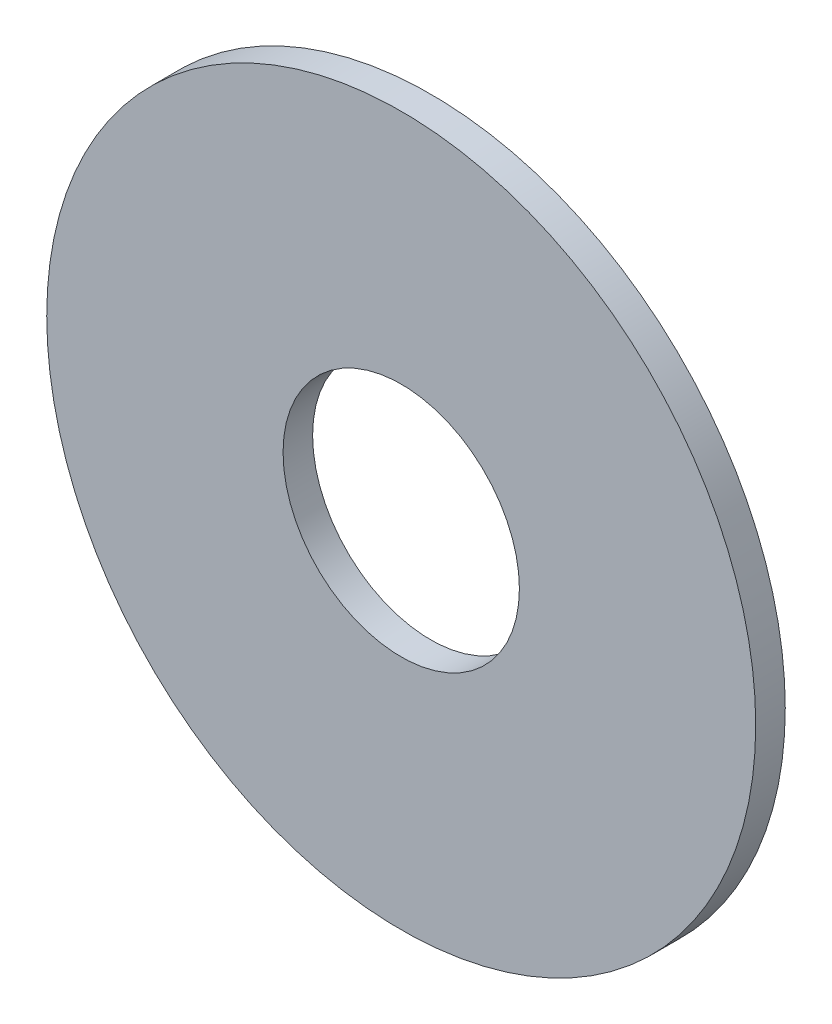
ISO-10303-21;
HEADER;
FILE_DESCRIPTION(('STEP AP214'),'2;1');
FILE_NAME('part.step','',(''),(''),'','','');
FILE_SCHEMA(('AUTOMOTIVE_DESIGN { 1 0 10303 214 1 1 1 1 }'));
ENDSEC;
DATA;
#1=APPLICATION_CONTEXT('core data for automotive mechanical design processes');
#2=APPLICATION_PROTOCOL_DEFINITION('international standard','automotive_design',2000,#1);
#3=PRODUCT_CONTEXT('',#1,'mechanical');
#4=PRODUCT('Part','Part','',(#3));
#5=PRODUCT_RELATED_PRODUCT_CATEGORY('part','',(#4));
#6=PRODUCT_DEFINITION_FORMATION('','',#4);
#7=PRODUCT_DEFINITION_CONTEXT('part definition',#1,'design');
#8=PRODUCT_DEFINITION('design','',#6,#7);
#9=PRODUCT_DEFINITION_SHAPE('','',#8);
#10=(LENGTH_UNIT() NAMED_UNIT(*) SI_UNIT(.MILLI.,.METRE.));
#11=(NAMED_UNIT(*) PLANE_ANGLE_UNIT() SI_UNIT($,.RADIAN.));
#12=(NAMED_UNIT(*) SI_UNIT($,.STERADIAN.) SOLID_ANGLE_UNIT());
#13=UNCERTAINTY_MEASURE_WITH_UNIT(LENGTH_MEASURE(1.E-05),#10,'distance_accuracy_value','');
#14=(GEOMETRIC_REPRESENTATION_CONTEXT(3) GLOBAL_UNCERTAINTY_ASSIGNED_CONTEXT((#13)) GLOBAL_UNIT_ASSIGNED_CONTEXT((#10,
#11,#12)) REPRESENTATION_CONTEXT('',''));
#15=CARTESIAN_POINT('',(0.,0.,0.));
#16=DIRECTION('',(0.,0.,1.));
#17=DIRECTION('',(1.,0.,0.));
#18=AXIS2_PLACEMENT_3D('',#15,#16,#17);
#19=CARTESIAN_POINT('',(0.,0.,0.5));
#20=DIRECTION('',(0.,0.,1.));
#21=DIRECTION('',(1.,0.,0.));
#22=AXIS2_PLACEMENT_3D('',#19,#20,#21);
#23=PLANE('',#22);
#24=CARTESIAN_POINT('',(0.,0.,0.5));
#25=DIRECTION('',(0.,0.,1.));
#26=DIRECTION('',(1.,0.,0.));
#27=AXIS2_PLACEMENT_3D('',#24,#25,#26);
#28=CIRCLE('',#27,6.);
#29=CARTESIAN_POINT('',(6.,0.,0.5));
#30=VERTEX_POINT('',#29);
#31=EDGE_CURVE('E10',#30,#30,#28,.T.);
#32=ORIENTED_EDGE('',*,*,#31,.T.);
#33=EDGE_LOOP('',(#32));
#34=FACE_BOUND('',#33,.T.);
#35=CARTESIAN_POINT('',(0.,0.,0.5));
#36=DIRECTION('',(0.,0.,1.));
#37=DIRECTION('',(1.,0.,0.));
#38=AXIS2_PLACEMENT_3D('',#35,#36,#37);
#39=CIRCLE('',#38,2.);
#40=CARTESIAN_POINT('',(2.,0.,0.5));
#41=VERTEX_POINT('',#40);
#42=EDGE_CURVE('E51',#41,#41,#39,.T.);
#43=ORIENTED_EDGE('',*,*,#42,.F.);
#44=EDGE_LOOP('',(#43));
#45=FACE_BOUND('',#44,.T.);
#46=ADVANCED_FACE('F40',(#34,#45),#23,.T.);
#47=CARTESIAN_POINT('',(0.,0.,0.));
#48=DIRECTION('',(0.,0.,1.));
#49=DIRECTION('',(1.,0.,0.));
#50=AXIS2_PLACEMENT_3D('',#47,#48,#49);
#51=PLANE('',#50);
#52=CARTESIAN_POINT('',(0.,0.,0.));
#53=DIRECTION('',(0.,0.,1.));
#54=DIRECTION('',(1.,0.,0.));
#55=AXIS2_PLACEMENT_3D('',#52,#53,#54);
#56=CIRCLE('',#55,6.);
#57=CARTESIAN_POINT('',(6.,0.,0.));
#58=VERTEX_POINT('',#57);
#59=EDGE_CURVE('E44',#58,#58,#56,.T.);
#60=ORIENTED_EDGE('',*,*,#59,.F.);
#61=EDGE_LOOP('',(#60));
#62=FACE_BOUND('',#61,.T.);
#63=CARTESIAN_POINT('',(0.,0.,0.));
#64=DIRECTION('',(0.,0.,1.));
#65=DIRECTION('',(1.,0.,0.));
#66=AXIS2_PLACEMENT_3D('',#63,#64,#65);
#67=CIRCLE('',#66,2.);
#68=CARTESIAN_POINT('',(2.,0.,0.));
#69=VERTEX_POINT('',#68);
#70=EDGE_CURVE('E53',#69,#69,#67,.T.);
#71=ORIENTED_EDGE('',*,*,#70,.T.);
#72=EDGE_LOOP('',(#71));
#73=FACE_BOUND('',#72,.T.);
#74=ADVANCED_FACE('F63',(#62,#73),#51,.F.);
#75=CARTESIAN_POINT('',(0.,0.,0.5));
#76=DIRECTION('',(0.,0.,-1.));
#77=DIRECTION('',(-1.,0.,0.));
#78=AXIS2_PLACEMENT_3D('',#75,#76,#77);
#79=CYLINDRICAL_SURFACE('',#78,6.);
#80=ORIENTED_EDGE('',*,*,#31,.F.);
#81=EDGE_LOOP('',(#80));
#82=FACE_BOUND('',#81,.T.);
#83=ORIENTED_EDGE('',*,*,#59,.T.);
#84=EDGE_LOOP('',(#83));
#85=FACE_BOUND('',#84,.T.);
#86=ADVANCED_FACE('F42',(#82,#85),#79,.T.);
#87=CARTESIAN_POINT('',(0.,0.,0.5));
#88=DIRECTION('',(0.,0.,-1.));
#89=DIRECTION('',(-1.,0.,0.));
#90=AXIS2_PLACEMENT_3D('',#87,#88,#89);
#91=CYLINDRICAL_SURFACE('',#90,2.);
#92=ORIENTED_EDGE('',*,*,#42,.T.);
#93=EDGE_LOOP('',(#92));
#94=FACE_BOUND('',#93,.T.);
#95=ORIENTED_EDGE('',*,*,#70,.F.);
#96=EDGE_LOOP('',(#95));
#97=FACE_BOUND('',#96,.T.);
#98=ADVANCED_FACE('F59',(#94,#97),#91,.F.);
#99=CLOSED_SHELL('',(#46,#74,#86,#98));
#100=MANIFOLD_SOLID_BREP('B2',#99);
#101=ADVANCED_BREP_SHAPE_REPRESENTATION('',(#18,#100),#14);
#102=SHAPE_DEFINITION_REPRESENTATION(#9,#101);
ENDSEC;
END-ISO-10303-21;
